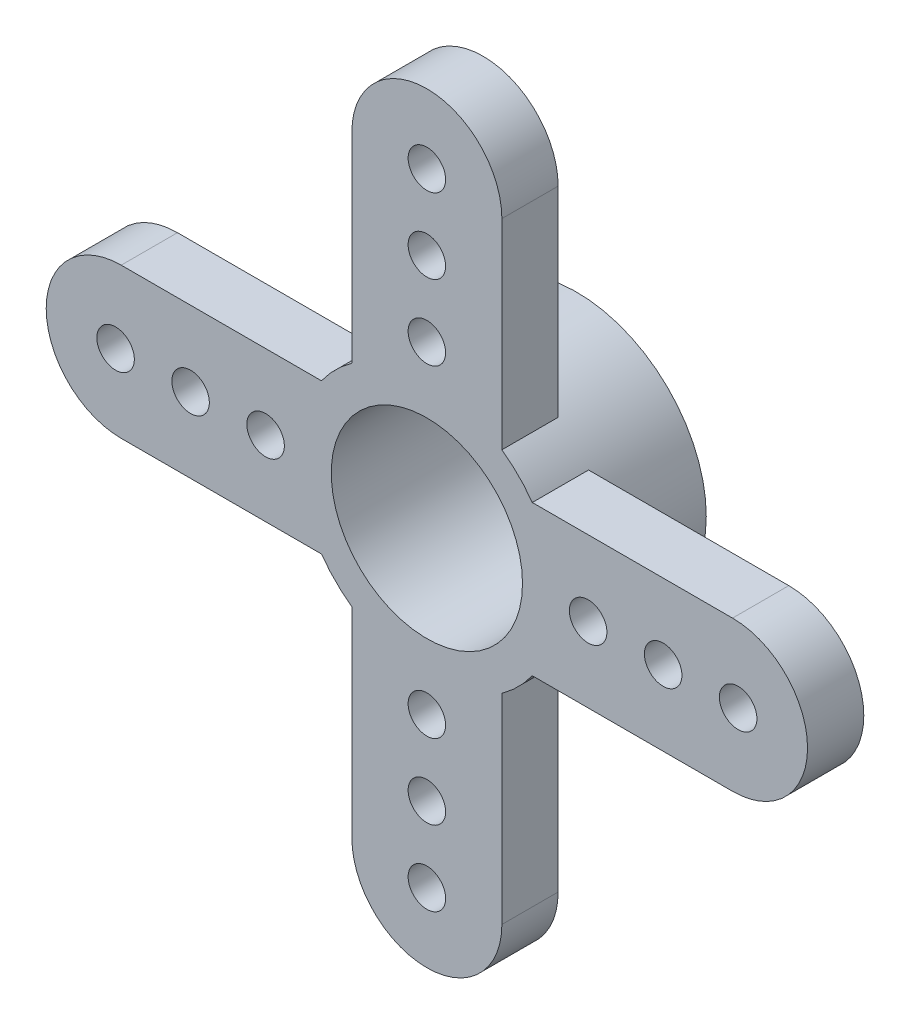
ISO-10303-21;
HEADER;
FILE_DESCRIPTION(('STEP AP214'),'2;1');
FILE_NAME('part.step','',(''),(''),'','','');
FILE_SCHEMA(('AUTOMOTIVE_DESIGN { 1 0 10303 214 1 1 1 1 }'));
ENDSEC;
DATA;
#1=APPLICATION_CONTEXT('core data for automotive mechanical design processes');
#2=APPLICATION_PROTOCOL_DEFINITION('international standard','automotive_design',2000,#1);
#3=PRODUCT_CONTEXT('',#1,'mechanical');
#4=PRODUCT('Part','Part','',(#3));
#5=PRODUCT_RELATED_PRODUCT_CATEGORY('part','',(#4));
#6=PRODUCT_DEFINITION_FORMATION('','',#4);
#7=PRODUCT_DEFINITION_CONTEXT('part definition',#1,'design');
#8=PRODUCT_DEFINITION('design','',#6,#7);
#9=PRODUCT_DEFINITION_SHAPE('','',#8);
#10=(LENGTH_UNIT() NAMED_UNIT(*) SI_UNIT(.MILLI.,.METRE.));
#11=(NAMED_UNIT(*) PLANE_ANGLE_UNIT() SI_UNIT($,.RADIAN.));
#12=(NAMED_UNIT(*) SI_UNIT($,.STERADIAN.) SOLID_ANGLE_UNIT());
#13=UNCERTAINTY_MEASURE_WITH_UNIT(LENGTH_MEASURE(1.E-05),#10,'distance_accuracy_value','');
#14=(GEOMETRIC_REPRESENTATION_CONTEXT(3) GLOBAL_UNCERTAINTY_ASSIGNED_CONTEXT((#13)) GLOBAL_UNIT_ASSIGNED_CONTEXT((#10,
#11,#12)) REPRESENTATION_CONTEXT('',''));
#15=CARTESIAN_POINT('',(0.,0.,0.));
#16=DIRECTION('',(0.,0.,1.));
#17=DIRECTION('',(1.,0.,0.));
#18=AXIS2_PLACEMENT_3D('',#15,#16,#17);
#19=CARTESIAN_POINT('',(0.,0.,0.));
#20=DIRECTION('',(0.,0.,1.));
#21=DIRECTION('',(1.,0.,0.));
#22=AXIS2_PLACEMENT_3D('',#19,#20,#21);
#23=PLANE('',#22);
#24=CARTESIAN_POINT('',(0.,4.3,0.));
#25=DIRECTION('',(0.,0.,1.));
#26=DIRECTION('',(1.,0.,0.));
#27=AXIS2_PLACEMENT_3D('',#24,#25,#26);
#28=CIRCLE('',#27,0.5);
#29=CARTESIAN_POINT('',(0.5,4.3,0.));
#30=VERTEX_POINT('',#29);
#31=EDGE_CURVE('E262',#30,#30,#28,.F.);
#32=ORIENTED_EDGE('',*,*,#31,.F.);
#33=EDGE_LOOP('',(#32));
#34=FACE_BOUND('',#33,.T.);
#35=CARTESIAN_POINT('',(0.,6.3,0.));
#36=DIRECTION('',(0.,0.,1.));
#37=DIRECTION('',(1.,0.,0.));
#38=AXIS2_PLACEMENT_3D('',#35,#36,#37);
#39=CIRCLE('',#38,0.5);
#40=CARTESIAN_POINT('',(0.5,6.3,0.));
#41=VERTEX_POINT('',#40);
#42=EDGE_CURVE('E259',#41,#41,#39,.F.);
#43=ORIENTED_EDGE('',*,*,#42,.F.);
#44=EDGE_LOOP('',(#43));
#45=FACE_BOUND('',#44,.T.);
#46=CARTESIAN_POINT('',(0.,8.3,0.));
#47=DIRECTION('',(0.,0.,1.));
#48=DIRECTION('',(1.,0.,0.));
#49=AXIS2_PLACEMENT_3D('',#46,#47,#48);
#50=CIRCLE('',#49,0.5);
#51=CARTESIAN_POINT('',(0.5,8.3,0.));
#52=VERTEX_POINT('',#51);
#53=EDGE_CURVE('E254',#52,#52,#50,.F.);
#54=ORIENTED_EDGE('',*,*,#53,.F.);
#55=EDGE_LOOP('',(#54));
#56=FACE_BOUND('',#55,.T.);
#57=DIRECTION('',(0.,1.,0.));
#58=VECTOR('',#57,1.);
#59=CARTESIAN_POINT('',(2.,-8.15,0.));
#60=LINE('',#59,#58);
#61=CARTESIAN_POINT('',(2.,2.81113855937412,0.));
#62=VERTEX_POINT('',#61);
#63=CARTESIAN_POINT('',(2.,8.15,0.));
#64=VERTEX_POINT('',#63);
#65=EDGE_CURVE('E169',#62,#64,#60,.T.);
#66=ORIENTED_EDGE('',*,*,#65,.F.);
#67=CARTESIAN_POINT('',(0.,0.,0.));
#68=DIRECTION('',(0.,0.,1.));
#69=DIRECTION('',(1.,0.,0.));
#70=AXIS2_PLACEMENT_3D('',#67,#68,#69);
#71=CIRCLE('',#70,3.45);
#72=CARTESIAN_POINT('',(-2.,2.81113855937412,0.));
#73=VERTEX_POINT('',#72);
#74=EDGE_CURVE('E11',#62,#73,#71,.T.);
#75=ORIENTED_EDGE('',*,*,#74,.T.);
#76=DIRECTION('',(0.,-1.,0.));
#77=VECTOR('',#76,1.);
#78=CARTESIAN_POINT('',(-2.,-8.15,0.));
#79=LINE('',#78,#77);
#80=CARTESIAN_POINT('',(-2.,8.15,0.));
#81=VERTEX_POINT('',#80);
#82=EDGE_CURVE('E179',#81,#73,#79,.T.);
#83=ORIENTED_EDGE('',*,*,#82,.F.);
#84=CARTESIAN_POINT('',(0.,8.15,0.));
#85=DIRECTION('',(0.,0.,1.));
#86=DIRECTION('',(1.,0.,0.));
#87=AXIS2_PLACEMENT_3D('',#84,#85,#86);
#88=CIRCLE('',#87,2.);
#89=EDGE_CURVE('E176',#64,#81,#88,.T.);
#90=ORIENTED_EDGE('',*,*,#89,.F.);
#91=EDGE_LOOP('',(#66,#75,#83,#90));
#92=FACE_BOUND('',#91,.T.);
#93=ADVANCED_FACE('F43',(#34,#45,#56,#92),#23,.F.);
#94=CARTESIAN_POINT('',(-8.3,0.,0.));
#95=DIRECTION('',(0.,0.,1.));
#96=DIRECTION('',(1.,0.,0.));
#97=AXIS2_PLACEMENT_3D('',#94,#95,#96);
#98=CIRCLE('',#97,0.5);
#99=CARTESIAN_POINT('',(-7.8,0.,0.));
#100=VERTEX_POINT('',#99);
#101=EDGE_CURVE('E287',#100,#100,#98,.F.);
#102=ORIENTED_EDGE('',*,*,#101,.F.);
#103=EDGE_LOOP('',(#102));
#104=FACE_BOUND('',#103,.T.);
#105=CARTESIAN_POINT('',(-4.3,0.,0.));
#106=DIRECTION('',(0.,0.,1.));
#107=DIRECTION('',(1.,0.,0.));
#108=AXIS2_PLACEMENT_3D('',#105,#106,#107);
#109=CIRCLE('',#108,0.5);
#110=CARTESIAN_POINT('',(-3.8,0.,0.));
#111=VERTEX_POINT('',#110);
#112=EDGE_CURVE('E274',#111,#111,#109,.F.);
#113=ORIENTED_EDGE('',*,*,#112,.F.);
#114=EDGE_LOOP('',(#113));
#115=FACE_BOUND('',#114,.T.);
#116=CARTESIAN_POINT('',(-6.3,0.,0.));
#117=DIRECTION('',(0.,0.,1.));
#118=DIRECTION('',(1.,0.,0.));
#119=AXIS2_PLACEMENT_3D('',#116,#117,#118);
#120=CIRCLE('',#119,0.5);
#121=CARTESIAN_POINT('',(-5.8,0.,0.));
#122=VERTEX_POINT('',#121);
#123=EDGE_CURVE('E275',#122,#122,#120,.F.);
#124=ORIENTED_EDGE('',*,*,#123,.F.);
#125=EDGE_LOOP('',(#124));
#126=FACE_BOUND('',#125,.T.);
#127=DIRECTION('',(-1.,0.,0.));
#128=VECTOR('',#127,1.);
#129=CARTESIAN_POINT('',(-8.15,2.,0.));
#130=LINE('',#129,#128);
#131=CARTESIAN_POINT('',(-2.81113855937412,2.,0.));
#132=VERTEX_POINT('',#131);
#133=CARTESIAN_POINT('',(-8.15,2.,0.));
#134=VERTEX_POINT('',#133);
#135=EDGE_CURVE('E215',#132,#134,#130,.T.);
#136=ORIENTED_EDGE('',*,*,#135,.F.);
#137=CARTESIAN_POINT('',(-2.81113855937412,-2.,0.));
#138=VERTEX_POINT('',#137);
#139=EDGE_CURVE('E55',#132,#138,#71,.T.);
#140=ORIENTED_EDGE('',*,*,#139,.T.);
#141=DIRECTION('',(1.,0.,0.));
#142=VECTOR('',#141,1.);
#143=CARTESIAN_POINT('',(-8.15,-2.,0.));
#144=LINE('',#143,#142);
#145=CARTESIAN_POINT('',(-8.15,-2.,0.));
#146=VERTEX_POINT('',#145);
#147=EDGE_CURVE('E207',#146,#138,#144,.T.);
#148=ORIENTED_EDGE('',*,*,#147,.F.);
#149=CARTESIAN_POINT('',(-8.15,0.,0.));
#150=DIRECTION('',(0.,0.,1.));
#151=DIRECTION('',(1.,0.,0.));
#152=AXIS2_PLACEMENT_3D('',#149,#150,#151);
#153=CIRCLE('',#152,2.);
#154=EDGE_CURVE('E301',#134,#146,#153,.T.);
#155=ORIENTED_EDGE('',*,*,#154,.F.);
#156=EDGE_LOOP('',(#136,#140,#148,#155));
#157=FACE_BOUND('',#156,.T.);
#158=ADVANCED_FACE('F365',(#104,#115,#126,#157),#23,.F.);
#159=CARTESIAN_POINT('',(0.,-8.3,0.));
#160=DIRECTION('',(0.,0.,1.));
#161=DIRECTION('',(1.,0.,0.));
#162=AXIS2_PLACEMENT_3D('',#159,#160,#161);
#163=CIRCLE('',#162,0.5);
#164=CARTESIAN_POINT('',(0.5,-8.3,0.));
#165=VERTEX_POINT('',#164);
#166=EDGE_CURVE('E283',#165,#165,#163,.F.);
#167=ORIENTED_EDGE('',*,*,#166,.F.);
#168=EDGE_LOOP('',(#167));
#169=FACE_BOUND('',#168,.T.);
#170=CARTESIAN_POINT('',(0.,-6.3,0.));
#171=DIRECTION('',(0.,0.,1.));
#172=DIRECTION('',(1.,0.,0.));
#173=AXIS2_PLACEMENT_3D('',#170,#171,#172);
#174=CIRCLE('',#173,0.5);
#175=CARTESIAN_POINT('',(0.5,-6.3,0.));
#176=VERTEX_POINT('',#175);
#177=EDGE_CURVE('E284',#176,#176,#174,.F.);
#178=ORIENTED_EDGE('',*,*,#177,.F.);
#179=EDGE_LOOP('',(#178));
#180=FACE_BOUND('',#179,.T.);
#181=CARTESIAN_POINT('',(0.,-4.3,0.));
#182=DIRECTION('',(0.,0.,1.));
#183=DIRECTION('',(1.,0.,0.));
#184=AXIS2_PLACEMENT_3D('',#181,#182,#183);
#185=CIRCLE('',#184,0.5);
#186=CARTESIAN_POINT('',(0.5,-4.3,0.));
#187=VERTEX_POINT('',#186);
#188=EDGE_CURVE('E279',#187,#187,#185,.F.);
#189=ORIENTED_EDGE('',*,*,#188,.F.);
#190=EDGE_LOOP('',(#189));
#191=FACE_BOUND('',#190,.T.);
#192=CARTESIAN_POINT('',(-2.,-2.81113855937412,0.));
#193=VERTEX_POINT('',#192);
#194=CARTESIAN_POINT('',(-2.,-8.15,0.));
#195=VERTEX_POINT('',#194);
#196=EDGE_CURVE('E185',#193,#195,#79,.T.);
#197=ORIENTED_EDGE('',*,*,#196,.F.);
#198=CARTESIAN_POINT('',(2.,-2.81113855937412,0.));
#199=VERTEX_POINT('',#198);
#200=EDGE_CURVE('E358',#193,#199,#71,.T.);
#201=ORIENTED_EDGE('',*,*,#200,.T.);
#202=CARTESIAN_POINT('',(2.,-8.15,0.));
#203=VERTEX_POINT('',#202);
#204=EDGE_CURVE('E177',#203,#199,#60,.T.);
#205=ORIENTED_EDGE('',*,*,#204,.F.);
#206=CARTESIAN_POINT('',(0.,-8.15,0.));
#207=DIRECTION('',(0.,0.,1.));
#208=DIRECTION('',(1.,0.,0.));
#209=AXIS2_PLACEMENT_3D('',#206,#207,#208);
#210=CIRCLE('',#209,2.);
#211=EDGE_CURVE('E313',#195,#203,#210,.T.);
#212=ORIENTED_EDGE('',*,*,#211,.F.);
#213=EDGE_LOOP('',(#197,#201,#205,#212));
#214=FACE_BOUND('',#213,.T.);
#215=ADVANCED_FACE('F368',(#169,#180,#191,#214),#23,.F.);
#216=CARTESIAN_POINT('',(0.,0.,1.5));
#217=DIRECTION('',(0.,0.,-1.));
#218=DIRECTION('',(-1.,0.,0.));
#219=AXIS2_PLACEMENT_3D('',#216,#217,#218);
#220=CYLINDRICAL_SURFACE('',#219,3.45);
#221=DIRECTION('',(0.,0.,-1.));
#222=VECTOR('',#221,1.);
#223=CARTESIAN_POINT('',(2.,2.81113855937412,1.5));
#224=LINE('',#223,#222);
#225=CARTESIAN_POINT('',(2.,2.81113855937412,1.5));
#226=VERTEX_POINT('',#225);
#227=EDGE_CURVE('E160',#226,#62,#224,.T.);
#228=ORIENTED_EDGE('',*,*,#227,.F.);
#229=CARTESIAN_POINT('',(0.,0.,1.5));
#230=DIRECTION('',(0.,0.,1.));
#231=DIRECTION('',(1.,0.,0.));
#232=AXIS2_PLACEMENT_3D('',#229,#230,#231);
#233=CIRCLE('',#232,3.45);
#234=CARTESIAN_POINT('',(2.81113855937412,2.,1.5));
#235=VERTEX_POINT('',#234);
#236=EDGE_CURVE('E239',#235,#226,#233,.T.);
#237=ORIENTED_EDGE('',*,*,#236,.F.);
#238=DIRECTION('',(0.,0.,-1.));
#239=VECTOR('',#238,1.);
#240=CARTESIAN_POINT('',(2.81113855937412,2.,1.5));
#241=LINE('',#240,#239);
#242=CARTESIAN_POINT('',(2.81113855937412,2.,0.));
#243=VERTEX_POINT('',#242);
#244=EDGE_CURVE('E229',#243,#235,#241,.F.);
#245=ORIENTED_EDGE('',*,*,#244,.F.);
#246=CARTESIAN_POINT('',(2.81113855937412,-2.,0.));
#247=VERTEX_POINT('',#246);
#248=EDGE_CURVE('E53',#247,#243,#71,.T.);
#249=ORIENTED_EDGE('',*,*,#248,.F.);
#250=DIRECTION('',(0.,0.,-1.));
#251=VECTOR('',#250,1.);
#252=CARTESIAN_POINT('',(2.81113855937412,-2.,1.5));
#253=LINE('',#252,#251);
#254=CARTESIAN_POINT('',(2.81113855937412,-2.,1.5));
#255=VERTEX_POINT('',#254);
#256=EDGE_CURVE('E235',#255,#247,#253,.T.);
#257=ORIENTED_EDGE('',*,*,#256,.F.);
#258=CARTESIAN_POINT('',(2.,-2.81113855937412,1.5));
#259=VERTEX_POINT('',#258);
#260=EDGE_CURVE('E236',#259,#255,#233,.T.);
#261=ORIENTED_EDGE('',*,*,#260,.F.);
#262=DIRECTION('',(0.,0.,-1.));
#263=VECTOR('',#262,1.);
#264=CARTESIAN_POINT('',(2.,-2.81113855937412,1.5));
#265=LINE('',#264,#263);
#266=EDGE_CURVE('E174',#199,#259,#265,.F.);
#267=ORIENTED_EDGE('',*,*,#266,.F.);
#268=ORIENTED_EDGE('',*,*,#200,.F.);
#269=DIRECTION('',(0.,0.,-1.));
#270=VECTOR('',#269,1.);
#271=CARTESIAN_POINT('',(-2.,-2.81113855937412,1.5));
#272=LINE('',#271,#270);
#273=CARTESIAN_POINT('',(-2.,-2.81113855937412,1.5));
#274=VERTEX_POINT('',#273);
#275=EDGE_CURVE('E64',#274,#193,#272,.T.);
#276=ORIENTED_EDGE('',*,*,#275,.F.);
#277=CARTESIAN_POINT('',(-2.81113855937412,-2.,1.5));
#278=VERTEX_POINT('',#277);
#279=EDGE_CURVE('E244',#278,#274,#233,.T.);
#280=ORIENTED_EDGE('',*,*,#279,.F.);
#281=DIRECTION('',(0.,0.,-1.));
#282=VECTOR('',#281,1.);
#283=CARTESIAN_POINT('',(-2.81113855937412,-2.,1.5));
#284=LINE('',#283,#282);
#285=EDGE_CURVE('E232',#138,#278,#284,.F.);
#286=ORIENTED_EDGE('',*,*,#285,.F.);
#287=ORIENTED_EDGE('',*,*,#139,.F.);
#288=DIRECTION('',(0.,0.,-1.));
#289=VECTOR('',#288,1.);
#290=CARTESIAN_POINT('',(-2.81113855937412,2.,1.5));
#291=LINE('',#290,#289);
#292=CARTESIAN_POINT('',(-2.81113855937412,2.,1.5));
#293=VERTEX_POINT('',#292);
#294=EDGE_CURVE('E228',#293,#132,#291,.T.);
#295=ORIENTED_EDGE('',*,*,#294,.F.);
#296=CARTESIAN_POINT('',(-2.,2.81113855937412,1.5));
#297=VERTEX_POINT('',#296);
#298=EDGE_CURVE('E69',#297,#293,#233,.T.);
#299=ORIENTED_EDGE('',*,*,#298,.F.);
#300=DIRECTION('',(0.,0.,-1.));
#301=VECTOR('',#300,1.);
#302=CARTESIAN_POINT('',(-2.,2.81113855937412,1.5));
#303=LINE('',#302,#301);
#304=EDGE_CURVE('E157',#73,#297,#303,.F.);
#305=ORIENTED_EDGE('',*,*,#304,.F.);
#306=ORIENTED_EDGE('',*,*,#74,.F.);
#307=EDGE_LOOP('',(#228,#237,#245,#249,#257,#261,#267,#268,#276,#280,#286,#287,#295,#299,#305,#306));
#308=FACE_BOUND('',#307,.T.);
#309=CARTESIAN_POINT('',(0.,0.,-2.5));
#310=DIRECTION('',(0.,0.,1.));
#311=DIRECTION('',(1.,0.,0.));
#312=AXIS2_PLACEMENT_3D('',#309,#310,#311);
#313=CIRCLE('',#312,3.45);
#314=CARTESIAN_POINT('',(3.45,0.,-2.5));
#315=VERTEX_POINT('',#314);
#316=EDGE_CURVE('E242',#315,#315,#313,.T.);
#317=ORIENTED_EDGE('',*,*,#316,.T.);
#318=EDGE_LOOP('',(#317));
#319=FACE_BOUND('',#318,.T.);
#320=ADVANCED_FACE('F44',(#308,#319),#220,.T.);
#321=CARTESIAN_POINT('',(0.,0.,1.5));
#322=DIRECTION('',(0.,0.,1.));
#323=DIRECTION('',(1.,0.,0.));
#324=AXIS2_PLACEMENT_3D('',#321,#322,#323);
#325=PLANE('',#324);
#326=CARTESIAN_POINT('',(-8.3,0.,1.5));
#327=DIRECTION('',(0.,0.,1.));
#328=DIRECTION('',(1.,0.,0.));
#329=AXIS2_PLACEMENT_3D('',#326,#327,#328);
#330=CIRCLE('',#329,0.5);
#331=CARTESIAN_POINT('',(-7.8,0.,1.5));
#332=VERTEX_POINT('',#331);
#333=EDGE_CURVE('E250',#332,#332,#330,.T.);
#334=ORIENTED_EDGE('',*,*,#333,.F.);
#335=EDGE_LOOP('',(#334));
#336=FACE_BOUND('',#335,.T.);
#337=CARTESIAN_POINT('',(8.3,0.,1.5));
#338=DIRECTION('',(0.,0.,1.));
#339=DIRECTION('',(1.,0.,0.));
#340=AXIS2_PLACEMENT_3D('',#337,#338,#339);
#341=CIRCLE('',#340,0.5);
#342=CARTESIAN_POINT('',(8.8,0.,1.5));
#343=VERTEX_POINT('',#342);
#344=EDGE_CURVE('E476',#343,#343,#341,.T.);
#345=ORIENTED_EDGE('',*,*,#344,.F.);
#346=EDGE_LOOP('',(#345));
#347=FACE_BOUND('',#346,.T.);
#348=CARTESIAN_POINT('',(0.,-8.3,1.5));
#349=DIRECTION('',(0.,0.,1.));
#350=DIRECTION('',(1.,0.,0.));
#351=AXIS2_PLACEMENT_3D('',#348,#349,#350);
#352=CIRCLE('',#351,0.5);
#353=CARTESIAN_POINT('',(0.5,-8.3,1.5));
#354=VERTEX_POINT('',#353);
#355=EDGE_CURVE('E471',#354,#354,#352,.T.);
#356=ORIENTED_EDGE('',*,*,#355,.F.);
#357=EDGE_LOOP('',(#356));
#358=FACE_BOUND('',#357,.T.);
#359=CARTESIAN_POINT('',(0.,-6.3,1.5));
#360=DIRECTION('',(0.,0.,1.));
#361=DIRECTION('',(1.,0.,0.));
#362=AXIS2_PLACEMENT_3D('',#359,#360,#361);
#363=CIRCLE('',#362,0.5);
#364=CARTESIAN_POINT('',(0.5,-6.3,1.5));
#365=VERTEX_POINT('',#364);
#366=EDGE_CURVE('E470',#365,#365,#363,.T.);
#367=ORIENTED_EDGE('',*,*,#366,.F.);
#368=EDGE_LOOP('',(#367));
#369=FACE_BOUND('',#368,.T.);
#370=CARTESIAN_POINT('',(0.,-4.3,1.5));
#371=DIRECTION('',(0.,0.,1.));
#372=DIRECTION('',(1.,0.,0.));
#373=AXIS2_PLACEMENT_3D('',#370,#371,#372);
#374=CIRCLE('',#373,0.5);
#375=CARTESIAN_POINT('',(0.5,-4.3,1.5));
#376=VERTEX_POINT('',#375);
#377=EDGE_CURVE('E475',#376,#376,#374,.T.);
#378=ORIENTED_EDGE('',*,*,#377,.F.);
#379=EDGE_LOOP('',(#378));
#380=FACE_BOUND('',#379,.T.);
#381=CARTESIAN_POINT('',(6.3,0.,1.5));
#382=DIRECTION('',(0.,0.,1.));
#383=DIRECTION('',(1.,0.,0.));
#384=AXIS2_PLACEMENT_3D('',#381,#382,#383);
#385=CIRCLE('',#384,0.5);
#386=CARTESIAN_POINT('',(6.8,0.,1.5));
#387=VERTEX_POINT('',#386);
#388=EDGE_CURVE('E481',#387,#387,#385,.T.);
#389=ORIENTED_EDGE('',*,*,#388,.F.);
#390=EDGE_LOOP('',(#389));
#391=FACE_BOUND('',#390,.T.);
#392=CARTESIAN_POINT('',(4.3,0.,1.5));
#393=DIRECTION('',(0.,0.,1.));
#394=DIRECTION('',(1.,0.,0.));
#395=AXIS2_PLACEMENT_3D('',#392,#393,#394);
#396=CIRCLE('',#395,0.5);
#397=CARTESIAN_POINT('',(4.8,0.,1.5));
#398=VERTEX_POINT('',#397);
#399=EDGE_CURVE('E486',#398,#398,#396,.T.);
#400=ORIENTED_EDGE('',*,*,#399,.F.);
#401=EDGE_LOOP('',(#400));
#402=FACE_BOUND('',#401,.T.);
#403=CARTESIAN_POINT('',(-4.3,0.,1.5));
#404=DIRECTION('',(0.,0.,1.));
#405=DIRECTION('',(1.,0.,0.));
#406=AXIS2_PLACEMENT_3D('',#403,#404,#405);
#407=CIRCLE('',#406,0.5);
#408=CARTESIAN_POINT('',(-3.8,0.,1.5));
#409=VERTEX_POINT('',#408);
#410=EDGE_CURVE('E467',#409,#409,#407,.T.);
#411=ORIENTED_EDGE('',*,*,#410,.F.);
#412=EDGE_LOOP('',(#411));
#413=FACE_BOUND('',#412,.T.);
#414=CARTESIAN_POINT('',(-6.3,0.,1.5));
#415=DIRECTION('',(0.,0.,1.));
#416=DIRECTION('',(1.,0.,0.));
#417=AXIS2_PLACEMENT_3D('',#414,#415,#416);
#418=CIRCLE('',#417,0.5);
#419=CARTESIAN_POINT('',(-5.8,0.,1.5));
#420=VERTEX_POINT('',#419);
#421=EDGE_CURVE('E463',#420,#420,#418,.T.);
#422=ORIENTED_EDGE('',*,*,#421,.F.);
#423=EDGE_LOOP('',(#422));
#424=FACE_BOUND('',#423,.T.);
#425=CARTESIAN_POINT('',(0.,4.3,1.5));
#426=DIRECTION('',(0.,0.,1.));
#427=DIRECTION('',(1.,0.,0.));
#428=AXIS2_PLACEMENT_3D('',#425,#426,#427);
#429=CIRCLE('',#428,0.5);
#430=CARTESIAN_POINT('',(0.5,4.3,1.5));
#431=VERTEX_POINT('',#430);
#432=EDGE_CURVE('E480',#431,#431,#429,.T.);
#433=ORIENTED_EDGE('',*,*,#432,.F.);
#434=EDGE_LOOP('',(#433));
#435=FACE_BOUND('',#434,.T.);
#436=CARTESIAN_POINT('',(0.,6.3,1.5));
#437=DIRECTION('',(0.,0.,1.));
#438=DIRECTION('',(1.,0.,0.));
#439=AXIS2_PLACEMENT_3D('',#436,#437,#438);
#440=CIRCLE('',#439,0.5);
#441=CARTESIAN_POINT('',(0.5,6.3,1.5));
#442=VERTEX_POINT('',#441);
#443=EDGE_CURVE('E495',#442,#442,#440,.T.);
#444=ORIENTED_EDGE('',*,*,#443,.F.);
#445=EDGE_LOOP('',(#444));
#446=FACE_BOUND('',#445,.T.);
#447=CARTESIAN_POINT('',(0.,8.3,1.5));
#448=DIRECTION('',(0.,0.,1.));
#449=DIRECTION('',(1.,0.,0.));
#450=AXIS2_PLACEMENT_3D('',#447,#448,#449);
#451=CIRCLE('',#450,0.5);
#452=CARTESIAN_POINT('',(0.5,8.3,1.5));
#453=VERTEX_POINT('',#452);
#454=EDGE_CURVE('E270',#453,#453,#451,.T.);
#455=ORIENTED_EDGE('',*,*,#454,.F.);
#456=EDGE_LOOP('',(#455));
#457=FACE_BOUND('',#456,.T.);
#458=CARTESIAN_POINT('',(0.,0.,1.5));
#459=DIRECTION('',(0.,0.,1.));
#460=DIRECTION('',(1.,0.,0.));
#461=AXIS2_PLACEMENT_3D('',#458,#459,#460);
#462=CIRCLE('',#461,2.55);
#463=CARTESIAN_POINT('',(2.55,0.,1.5));
#464=VERTEX_POINT('',#463);
#465=EDGE_CURVE('E246',#464,#464,#462,.T.);
#466=ORIENTED_EDGE('',*,*,#465,.F.);
#467=EDGE_LOOP('',(#466));
#468=FACE_BOUND('',#467,.T.);
#469=DIRECTION('',(0.,-1.,0.));
#470=VECTOR('',#469,1.);
#471=CARTESIAN_POINT('',(-2.,-8.15,1.5));
#472=LINE('',#471,#470);
#473=CARTESIAN_POINT('',(-2.,-8.15,1.5));
#474=VERTEX_POINT('',#473);
#475=EDGE_CURVE('E182',#274,#474,#472,.T.);
#476=ORIENTED_EDGE('',*,*,#475,.T.);
#477=CARTESIAN_POINT('',(0.,-8.15,1.5));
#478=DIRECTION('',(0.,0.,1.));
#479=DIRECTION('',(1.,0.,0.));
#480=AXIS2_PLACEMENT_3D('',#477,#478,#479);
#481=CIRCLE('',#480,2.);
#482=CARTESIAN_POINT('',(2.,-8.15,1.5));
#483=VERTEX_POINT('',#482);
#484=EDGE_CURVE('E294',#474,#483,#481,.T.);
#485=ORIENTED_EDGE('',*,*,#484,.T.);
#486=DIRECTION('',(0.,1.,0.));
#487=VECTOR('',#486,1.);
#488=CARTESIAN_POINT('',(2.,-8.15,1.5));
#489=LINE('',#488,#487);
#490=EDGE_CURVE('E188',#483,#259,#489,.T.);
#491=ORIENTED_EDGE('',*,*,#490,.T.);
#492=ORIENTED_EDGE('',*,*,#260,.T.);
#493=DIRECTION('',(1.,0.,0.));
#494=VECTOR('',#493,1.);
#495=CARTESIAN_POINT('',(-8.15,-2.,1.5));
#496=LINE('',#495,#494);
#497=CARTESIAN_POINT('',(8.15,-2.,1.5));
#498=VERTEX_POINT('',#497);
#499=EDGE_CURVE('E204',#255,#498,#496,.T.);
#500=ORIENTED_EDGE('',*,*,#499,.T.);
#501=CARTESIAN_POINT('',(8.15,0.,1.5));
#502=DIRECTION('',(0.,0.,1.));
#503=DIRECTION('',(1.,0.,0.));
#504=AXIS2_PLACEMENT_3D('',#501,#502,#503);
#505=CIRCLE('',#504,2.);
#506=CARTESIAN_POINT('',(8.15,2.,1.5));
#507=VERTEX_POINT('',#506);
#508=EDGE_CURVE('E293',#498,#507,#505,.T.);
#509=ORIENTED_EDGE('',*,*,#508,.T.);
#510=DIRECTION('',(-1.,0.,0.));
#511=VECTOR('',#510,1.);
#512=CARTESIAN_POINT('',(-8.15,2.,1.5));
#513=LINE('',#512,#511);
#514=EDGE_CURVE('E202',#507,#235,#513,.T.);
#515=ORIENTED_EDGE('',*,*,#514,.T.);
#516=ORIENTED_EDGE('',*,*,#236,.T.);
#517=CARTESIAN_POINT('',(2.,8.15,1.5));
#518=VERTEX_POINT('',#517);
#519=EDGE_CURVE('E168',#226,#518,#489,.T.);
#520=ORIENTED_EDGE('',*,*,#519,.T.);
#521=CARTESIAN_POINT('',(0.,8.15,1.5));
#522=DIRECTION('',(0.,0.,1.));
#523=DIRECTION('',(1.,0.,0.));
#524=AXIS2_PLACEMENT_3D('',#521,#522,#523);
#525=CIRCLE('',#524,2.);
#526=CARTESIAN_POINT('',(-2.,8.15,1.5));
#527=VERTEX_POINT('',#526);
#528=EDGE_CURVE('E306',#518,#527,#525,.T.);
#529=ORIENTED_EDGE('',*,*,#528,.T.);
#530=EDGE_CURVE('E316',#527,#297,#472,.T.);
#531=ORIENTED_EDGE('',*,*,#530,.T.);
#532=ORIENTED_EDGE('',*,*,#298,.T.);
#533=CARTESIAN_POINT('',(-8.15,2.,1.5));
#534=VERTEX_POINT('',#533);
#535=EDGE_CURVE('E201',#293,#534,#513,.T.);
#536=ORIENTED_EDGE('',*,*,#535,.T.);
#537=CARTESIAN_POINT('',(-8.15,0.,1.5));
#538=DIRECTION('',(0.,0.,1.));
#539=DIRECTION('',(1.,0.,0.));
#540=AXIS2_PLACEMENT_3D('',#537,#538,#539);
#541=CIRCLE('',#540,2.);
#542=CARTESIAN_POINT('',(-8.15,-2.,1.5));
#543=VERTEX_POINT('',#542);
#544=EDGE_CURVE('E303',#534,#543,#541,.T.);
#545=ORIENTED_EDGE('',*,*,#544,.T.);
#546=EDGE_CURVE('E199',#543,#278,#496,.T.);
#547=ORIENTED_EDGE('',*,*,#546,.T.);
#548=ORIENTED_EDGE('',*,*,#279,.T.);
#549=EDGE_LOOP('',(#476,#485,#491,#492,#500,#509,#515,#516,#520,#529,#531,#532,#536,#545,#547,#548));
#550=FACE_BOUND('',#549,.T.);
#551=ADVANCED_FACE('F319',(#336,#347,#358,#369,#380,#391,#402,#413,#424,#435,#446,#457,#468,
#550),#325,.T.);
#552=CARTESIAN_POINT('',(8.3,0.,0.));
#553=DIRECTION('',(0.,0.,1.));
#554=DIRECTION('',(1.,0.,0.));
#555=AXIS2_PLACEMENT_3D('',#552,#553,#554);
#556=CIRCLE('',#555,0.5);
#557=CARTESIAN_POINT('',(8.8,0.,0.));
#558=VERTEX_POINT('',#557);
#559=EDGE_CURVE('E50',#558,#558,#556,.F.);
#560=ORIENTED_EDGE('',*,*,#559,.F.);
#561=EDGE_LOOP('',(#560));
#562=FACE_BOUND('',#561,.T.);
#563=CARTESIAN_POINT('',(6.3,0.,0.));
#564=DIRECTION('',(0.,0.,1.));
#565=DIRECTION('',(1.,0.,0.));
#566=AXIS2_PLACEMENT_3D('',#563,#564,#565);
#567=CIRCLE('',#566,0.5);
#568=CARTESIAN_POINT('',(6.8,0.,0.));
#569=VERTEX_POINT('',#568);
#570=EDGE_CURVE('E248',#569,#569,#567,.F.);
#571=ORIENTED_EDGE('',*,*,#570,.F.);
#572=EDGE_LOOP('',(#571));
#573=FACE_BOUND('',#572,.T.);
#574=CARTESIAN_POINT('',(4.3,0.,0.));
#575=DIRECTION('',(0.,0.,1.));
#576=DIRECTION('',(1.,0.,0.));
#577=AXIS2_PLACEMENT_3D('',#574,#575,#576);
#578=CIRCLE('',#577,0.5);
#579=CARTESIAN_POINT('',(4.8,0.,0.));
#580=VERTEX_POINT('',#579);
#581=EDGE_CURVE('E247',#580,#580,#578,.F.);
#582=ORIENTED_EDGE('',*,*,#581,.F.);
#583=EDGE_LOOP('',(#582));
#584=FACE_BOUND('',#583,.T.);
#585=CARTESIAN_POINT('',(8.15,-2.,0.));
#586=VERTEX_POINT('',#585);
#587=EDGE_CURVE('E200',#247,#586,#144,.T.);
#588=ORIENTED_EDGE('',*,*,#587,.F.);
#589=ORIENTED_EDGE('',*,*,#248,.T.);
#590=CARTESIAN_POINT('',(8.15,2.,0.));
#591=VERTEX_POINT('',#590);
#592=EDGE_CURVE('E213',#591,#243,#130,.T.);
#593=ORIENTED_EDGE('',*,*,#592,.F.);
#594=CARTESIAN_POINT('',(8.15,0.,0.));
#595=DIRECTION('',(0.,0.,1.));
#596=DIRECTION('',(1.,0.,0.));
#597=AXIS2_PLACEMENT_3D('',#594,#595,#596);
#598=CIRCLE('',#597,2.);
#599=EDGE_CURVE('E300',#586,#591,#598,.T.);
#600=ORIENTED_EDGE('',*,*,#599,.F.);
#601=EDGE_LOOP('',(#588,#589,#593,#600));
#602=FACE_BOUND('',#601,.T.);
#603=ADVANCED_FACE('F359',(#562,#573,#584,#602),#23,.F.);
#604=CARTESIAN_POINT('',(-8.15,2.,1.5));
#605=DIRECTION('',(0.,-1.,0.));
#606=DIRECTION('',(0.,0.,-1.));
#607=AXIS2_PLACEMENT_3D('',#604,#605,#606);
#608=PLANE('',#607);
#609=ORIENTED_EDGE('',*,*,#592,.T.);
#610=ORIENTED_EDGE('',*,*,#244,.T.);
#611=ORIENTED_EDGE('',*,*,#514,.F.);
#612=DIRECTION('',(0.,0.,-1.));
#613=VECTOR('',#612,1.);
#614=CARTESIAN_POINT('',(8.15,2.,1.5));
#615=LINE('',#614,#613);
#616=EDGE_CURVE('E217',#507,#591,#615,.T.);
#617=ORIENTED_EDGE('',*,*,#616,.T.);
#618=EDGE_LOOP('',(#609,#610,#611,#617));
#619=FACE_BOUND('',#618,.T.);
#620=ADVANCED_FACE('F352',(#619),#608,.F.);
#621=CARTESIAN_POINT('',(-8.15,-2.,1.5));
#622=DIRECTION('',(0.,1.,0.));
#623=DIRECTION('',(0.,0.,1.));
#624=AXIS2_PLACEMENT_3D('',#621,#622,#623);
#625=PLANE('',#624);
#626=ORIENTED_EDGE('',*,*,#499,.F.);
#627=ORIENTED_EDGE('',*,*,#256,.T.);
#628=ORIENTED_EDGE('',*,*,#587,.T.);
#629=DIRECTION('',(0.,0.,-1.));
#630=VECTOR('',#629,1.);
#631=CARTESIAN_POINT('',(8.15,-2.,1.5));
#632=LINE('',#631,#630);
#633=EDGE_CURVE('E219',#498,#586,#632,.T.);
#634=ORIENTED_EDGE('',*,*,#633,.F.);
#635=EDGE_LOOP('',(#626,#627,#628,#634));
#636=FACE_BOUND('',#635,.T.);
#637=ADVANCED_FACE('F346',(#636),#625,.F.);
#638=ORIENTED_EDGE('',*,*,#147,.T.);
#639=ORIENTED_EDGE('',*,*,#285,.T.);
#640=ORIENTED_EDGE('',*,*,#546,.F.);
#641=DIRECTION('',(0.,0.,-1.));
#642=VECTOR('',#641,1.);
#643=CARTESIAN_POINT('',(-8.15,-2.,1.5));
#644=LINE('',#643,#642);
#645=EDGE_CURVE('E224',#543,#146,#644,.T.);
#646=ORIENTED_EDGE('',*,*,#645,.T.);
#647=EDGE_LOOP('',(#638,#639,#640,#646));
#648=FACE_BOUND('',#647,.T.);
#649=ADVANCED_FACE('F337',(#648),#625,.F.);
#650=ORIENTED_EDGE('',*,*,#535,.F.);
#651=ORIENTED_EDGE('',*,*,#294,.T.);
#652=ORIENTED_EDGE('',*,*,#135,.T.);
#653=DIRECTION('',(0.,0.,-1.));
#654=VECTOR('',#653,1.);
#655=CARTESIAN_POINT('',(-8.15,2.,1.5));
#656=LINE('',#655,#654);
#657=EDGE_CURVE('E208',#534,#134,#656,.T.);
#658=ORIENTED_EDGE('',*,*,#657,.F.);
#659=EDGE_LOOP('',(#650,#651,#652,#658));
#660=FACE_BOUND('',#659,.T.);
#661=ADVANCED_FACE('F335',(#660),#608,.F.);
#662=CARTESIAN_POINT('',(-2.,-8.15,1.5));
#663=DIRECTION('',(1.,0.,0.));
#664=DIRECTION('',(0.,0.,-1.));
#665=AXIS2_PLACEMENT_3D('',#662,#663,#664);
#666=PLANE('',#665);
#667=ORIENTED_EDGE('',*,*,#82,.T.);
#668=ORIENTED_EDGE('',*,*,#304,.T.);
#669=ORIENTED_EDGE('',*,*,#530,.F.);
#670=DIRECTION('',(0.,0.,-1.));
#671=VECTOR('',#670,1.);
#672=CARTESIAN_POINT('',(-2.,8.15,1.5));
#673=LINE('',#672,#671);
#674=EDGE_CURVE('E189',#527,#81,#673,.T.);
#675=ORIENTED_EDGE('',*,*,#674,.T.);
#676=EDGE_LOOP('',(#667,#668,#669,#675));
#677=FACE_BOUND('',#676,.T.);
#678=ADVANCED_FACE('F326',(#677),#666,.F.);
#679=CARTESIAN_POINT('',(2.,-8.15,1.5));
#680=DIRECTION('',(-1.,0.,0.));
#681=DIRECTION('',(0.,0.,1.));
#682=AXIS2_PLACEMENT_3D('',#679,#680,#681);
#683=PLANE('',#682);
#684=ORIENTED_EDGE('',*,*,#519,.F.);
#685=ORIENTED_EDGE('',*,*,#227,.T.);
#686=ORIENTED_EDGE('',*,*,#65,.T.);
#687=DIRECTION('',(0.,0.,-1.));
#688=VECTOR('',#687,1.);
#689=CARTESIAN_POINT('',(2.,8.15,1.5));
#690=LINE('',#689,#688);
#691=EDGE_CURVE('E190',#518,#64,#690,.T.);
#692=ORIENTED_EDGE('',*,*,#691,.F.);
#693=EDGE_LOOP('',(#684,#685,#686,#692));
#694=FACE_BOUND('',#693,.T.);
#695=ADVANCED_FACE('F167',(#694),#683,.F.);
#696=ORIENTED_EDGE('',*,*,#475,.F.);
#697=ORIENTED_EDGE('',*,*,#275,.T.);
#698=ORIENTED_EDGE('',*,*,#196,.T.);
#699=DIRECTION('',(0.,0.,-1.));
#700=VECTOR('',#699,1.);
#701=CARTESIAN_POINT('',(-2.,-8.15,1.5));
#702=LINE('',#701,#700);
#703=EDGE_CURVE('E171',#474,#195,#702,.T.);
#704=ORIENTED_EDGE('',*,*,#703,.F.);
#705=EDGE_LOOP('',(#696,#697,#698,#704));
#706=FACE_BOUND('',#705,.T.);
#707=ADVANCED_FACE('F387',(#706),#666,.F.);
#708=ORIENTED_EDGE('',*,*,#204,.T.);
#709=ORIENTED_EDGE('',*,*,#266,.T.);
#710=ORIENTED_EDGE('',*,*,#490,.F.);
#711=DIRECTION('',(0.,0.,-1.));
#712=VECTOR('',#711,1.);
#713=CARTESIAN_POINT('',(2.,-8.15,1.5));
#714=LINE('',#713,#712);
#715=EDGE_CURVE('E191',#483,#203,#714,.T.);
#716=ORIENTED_EDGE('',*,*,#715,.T.);
#717=EDGE_LOOP('',(#708,#709,#710,#716));
#718=FACE_BOUND('',#717,.T.);
#719=ADVANCED_FACE('F386',(#718),#683,.F.);
#720=CARTESIAN_POINT('',(0.,-8.15,1.5));
#721=DIRECTION('',(0.,0.,-1.));
#722=DIRECTION('',(-1.,0.,0.));
#723=AXIS2_PLACEMENT_3D('',#720,#721,#722);
#724=CYLINDRICAL_SURFACE('',#723,2.);
#725=ORIENTED_EDGE('',*,*,#211,.T.);
#726=ORIENTED_EDGE('',*,*,#715,.F.);
#727=ORIENTED_EDGE('',*,*,#484,.F.);
#728=ORIENTED_EDGE('',*,*,#703,.T.);
#729=EDGE_LOOP('',(#725,#726,#727,#728));
#730=FACE_BOUND('',#729,.T.);
#731=ADVANCED_FACE('F395',(#730),#724,.T.);
#732=CARTESIAN_POINT('',(0.,8.15,1.5));
#733=DIRECTION('',(0.,0.,-1.));
#734=DIRECTION('',(-1.,0.,0.));
#735=AXIS2_PLACEMENT_3D('',#732,#733,#734);
#736=CYLINDRICAL_SURFACE('',#735,2.);
#737=ORIENTED_EDGE('',*,*,#89,.T.);
#738=ORIENTED_EDGE('',*,*,#674,.F.);
#739=ORIENTED_EDGE('',*,*,#528,.F.);
#740=ORIENTED_EDGE('',*,*,#691,.T.);
#741=EDGE_LOOP('',(#737,#738,#739,#740));
#742=FACE_BOUND('',#741,.T.);
#743=ADVANCED_FACE('F322',(#742),#736,.T.);
#744=CARTESIAN_POINT('',(-8.15,0.,1.5));
#745=DIRECTION('',(0.,0.,-1.));
#746=DIRECTION('',(-1.,0.,0.));
#747=AXIS2_PLACEMENT_3D('',#744,#745,#746);
#748=CYLINDRICAL_SURFACE('',#747,2.);
#749=ORIENTED_EDGE('',*,*,#154,.T.);
#750=ORIENTED_EDGE('',*,*,#645,.F.);
#751=ORIENTED_EDGE('',*,*,#544,.F.);
#752=ORIENTED_EDGE('',*,*,#657,.T.);
#753=EDGE_LOOP('',(#749,#750,#751,#752));
#754=FACE_BOUND('',#753,.T.);
#755=ADVANCED_FACE('F336',(#754),#748,.T.);
#756=CARTESIAN_POINT('',(8.15,0.,1.5));
#757=DIRECTION('',(0.,0.,-1.));
#758=DIRECTION('',(-1.,0.,0.));
#759=AXIS2_PLACEMENT_3D('',#756,#757,#758);
#760=CYLINDRICAL_SURFACE('',#759,2.);
#761=ORIENTED_EDGE('',*,*,#599,.T.);
#762=ORIENTED_EDGE('',*,*,#616,.F.);
#763=ORIENTED_EDGE('',*,*,#508,.F.);
#764=ORIENTED_EDGE('',*,*,#633,.T.);
#765=EDGE_LOOP('',(#761,#762,#763,#764));
#766=FACE_BOUND('',#765,.T.);
#767=ADVANCED_FACE('F355',(#766),#760,.T.);
#768=CARTESIAN_POINT('',(0.,0.,-2.5));
#769=DIRECTION('',(0.,0.,1.));
#770=DIRECTION('',(1.,0.,0.));
#771=AXIS2_PLACEMENT_3D('',#768,#769,#770);
#772=PLANE('',#771);
#773=CARTESIAN_POINT('',(0.,0.,-2.5));
#774=DIRECTION('',(0.,0.,1.));
#775=DIRECTION('',(1.,0.,0.));
#776=AXIS2_PLACEMENT_3D('',#773,#774,#775);
#777=CIRCLE('',#776,2.55);
#778=CARTESIAN_POINT('',(2.55,0.,-2.5));
#779=VERTEX_POINT('',#778);
#780=EDGE_CURVE('E241',#779,#779,#777,.F.);
#781=ORIENTED_EDGE('',*,*,#780,.F.);
#782=EDGE_LOOP('',(#781));
#783=FACE_BOUND('',#782,.T.);
#784=ORIENTED_EDGE('',*,*,#316,.F.);
#785=EDGE_LOOP('',(#784));
#786=FACE_BOUND('',#785,.T.);
#787=ADVANCED_FACE('F404',(#783,#786),#772,.F.);
#788=CARTESIAN_POINT('',(0.,0.,1.5));
#789=DIRECTION('',(0.,0.,-1.));
#790=DIRECTION('',(-1.,0.,0.));
#791=AXIS2_PLACEMENT_3D('',#788,#789,#790);
#792=CYLINDRICAL_SURFACE('',#791,2.55);
#793=ORIENTED_EDGE('',*,*,#465,.T.);
#794=EDGE_LOOP('',(#793));
#795=FACE_BOUND('',#794,.T.);
#796=ORIENTED_EDGE('',*,*,#780,.T.);
#797=EDGE_LOOP('',(#796));
#798=FACE_BOUND('',#797,.T.);
#799=ADVANCED_FACE('F406',(#795,#798),#792,.F.);
#800=CARTESIAN_POINT('',(4.3,0.,1.5));
#801=DIRECTION('',(0.,0.,-1.));
#802=DIRECTION('',(-1.,0.,0.));
#803=AXIS2_PLACEMENT_3D('',#800,#801,#802);
#804=CYLINDRICAL_SURFACE('',#803,0.5);
#805=ORIENTED_EDGE('',*,*,#399,.T.);
#806=EDGE_LOOP('',(#805));
#807=FACE_BOUND('',#806,.T.);
#808=ORIENTED_EDGE('',*,*,#581,.T.);
#809=EDGE_LOOP('',(#808));
#810=FACE_BOUND('',#809,.T.);
#811=ADVANCED_FACE('F411',(#807,#810),#804,.F.);
#812=CARTESIAN_POINT('',(6.3,0.,1.5));
#813=DIRECTION('',(0.,0.,-1.));
#814=DIRECTION('',(-1.,0.,0.));
#815=AXIS2_PLACEMENT_3D('',#812,#813,#814);
#816=CYLINDRICAL_SURFACE('',#815,0.5);
#817=ORIENTED_EDGE('',*,*,#388,.T.);
#818=EDGE_LOOP('',(#817));
#819=FACE_BOUND('',#818,.T.);
#820=ORIENTED_EDGE('',*,*,#570,.T.);
#821=EDGE_LOOP('',(#820));
#822=FACE_BOUND('',#821,.T.);
#823=ADVANCED_FACE('F430',(#819,#822),#816,.F.);
#824=CARTESIAN_POINT('',(8.3,0.,1.5));
#825=DIRECTION('',(0.,0.,-1.));
#826=DIRECTION('',(-1.,0.,0.));
#827=AXIS2_PLACEMENT_3D('',#824,#825,#826);
#828=CYLINDRICAL_SURFACE('',#827,0.5);
#829=ORIENTED_EDGE('',*,*,#344,.T.);
#830=EDGE_LOOP('',(#829));
#831=FACE_BOUND('',#830,.T.);
#832=ORIENTED_EDGE('',*,*,#559,.T.);
#833=EDGE_LOOP('',(#832));
#834=FACE_BOUND('',#833,.T.);
#835=ADVANCED_FACE('F417',(#831,#834),#828,.F.);
#836=CARTESIAN_POINT('',(0.,8.3,1.5));
#837=DIRECTION('',(0.,0.,-1.));
#838=DIRECTION('',(-1.,0.,0.));
#839=AXIS2_PLACEMENT_3D('',#836,#837,#838);
#840=CYLINDRICAL_SURFACE('',#839,0.5);
#841=ORIENTED_EDGE('',*,*,#454,.T.);
#842=EDGE_LOOP('',(#841));
#843=FACE_BOUND('',#842,.T.);
#844=ORIENTED_EDGE('',*,*,#53,.T.);
#845=EDGE_LOOP('',(#844));
#846=FACE_BOUND('',#845,.T.);
#847=ADVANCED_FACE('F414',(#843,#846),#840,.F.);
#848=CARTESIAN_POINT('',(0.,6.3,1.5));
#849=DIRECTION('',(0.,0.,-1.));
#850=DIRECTION('',(-1.,0.,0.));
#851=AXIS2_PLACEMENT_3D('',#848,#849,#850);
#852=CYLINDRICAL_SURFACE('',#851,0.5);
#853=ORIENTED_EDGE('',*,*,#443,.T.);
#854=EDGE_LOOP('',(#853));
#855=FACE_BOUND('',#854,.T.);
#856=ORIENTED_EDGE('',*,*,#42,.T.);
#857=EDGE_LOOP('',(#856));
#858=FACE_BOUND('',#857,.T.);
#859=ADVANCED_FACE('F418',(#855,#858),#852,.F.);
#860=CARTESIAN_POINT('',(0.,4.3,1.5));
#861=DIRECTION('',(0.,0.,-1.));
#862=DIRECTION('',(-1.,0.,0.));
#863=AXIS2_PLACEMENT_3D('',#860,#861,#862);
#864=CYLINDRICAL_SURFACE('',#863,0.5);
#865=ORIENTED_EDGE('',*,*,#432,.T.);
#866=EDGE_LOOP('',(#865));
#867=FACE_BOUND('',#866,.T.);
#868=ORIENTED_EDGE('',*,*,#31,.T.);
#869=EDGE_LOOP('',(#868));
#870=FACE_BOUND('',#869,.T.);
#871=ADVANCED_FACE('F423',(#867,#870),#864,.F.);
#872=CARTESIAN_POINT('',(-6.3,0.,1.5));
#873=DIRECTION('',(0.,0.,-1.));
#874=DIRECTION('',(-1.,0.,0.));
#875=AXIS2_PLACEMENT_3D('',#872,#873,#874);
#876=CYLINDRICAL_SURFACE('',#875,0.5);
#877=ORIENTED_EDGE('',*,*,#421,.T.);
#878=EDGE_LOOP('',(#877));
#879=FACE_BOUND('',#878,.T.);
#880=ORIENTED_EDGE('',*,*,#123,.T.);
#881=EDGE_LOOP('',(#880));
#882=FACE_BOUND('',#881,.T.);
#883=ADVANCED_FACE('F422',(#879,#882),#876,.F.);
#884=CARTESIAN_POINT('',(-4.3,0.,1.5));
#885=DIRECTION('',(0.,0.,-1.));
#886=DIRECTION('',(-1.,0.,0.));
#887=AXIS2_PLACEMENT_3D('',#884,#885,#886);
#888=CYLINDRICAL_SURFACE('',#887,0.5);
#889=ORIENTED_EDGE('',*,*,#410,.T.);
#890=EDGE_LOOP('',(#889));
#891=FACE_BOUND('',#890,.T.);
#892=ORIENTED_EDGE('',*,*,#112,.T.);
#893=EDGE_LOOP('',(#892));
#894=FACE_BOUND('',#893,.T.);
#895=ADVANCED_FACE('F432',(#891,#894),#888,.F.);
#896=CARTESIAN_POINT('',(0.,-4.3,1.5));
#897=DIRECTION('',(0.,0.,-1.));
#898=DIRECTION('',(-1.,0.,0.));
#899=AXIS2_PLACEMENT_3D('',#896,#897,#898);
#900=CYLINDRICAL_SURFACE('',#899,0.5);
#901=ORIENTED_EDGE('',*,*,#377,.T.);
#902=EDGE_LOOP('',(#901));
#903=FACE_BOUND('',#902,.T.);
#904=ORIENTED_EDGE('',*,*,#188,.T.);
#905=EDGE_LOOP('',(#904));
#906=FACE_BOUND('',#905,.T.);
#907=ADVANCED_FACE('F440',(#903,#906),#900,.F.);
#908=CARTESIAN_POINT('',(0.,-6.3,1.5));
#909=DIRECTION('',(0.,0.,-1.));
#910=DIRECTION('',(-1.,0.,0.));
#911=AXIS2_PLACEMENT_3D('',#908,#909,#910);
#912=CYLINDRICAL_SURFACE('',#911,0.5);
#913=ORIENTED_EDGE('',*,*,#366,.T.);
#914=EDGE_LOOP('',(#913));
#915=FACE_BOUND('',#914,.T.);
#916=ORIENTED_EDGE('',*,*,#177,.T.);
#917=EDGE_LOOP('',(#916));
#918=FACE_BOUND('',#917,.T.);
#919=ADVANCED_FACE('F449',(#915,#918),#912,.F.);
#920=CARTESIAN_POINT('',(0.,-8.3,1.5));
#921=DIRECTION('',(0.,0.,-1.));
#922=DIRECTION('',(-1.,0.,0.));
#923=AXIS2_PLACEMENT_3D('',#920,#921,#922);
#924=CYLINDRICAL_SURFACE('',#923,0.5);
#925=ORIENTED_EDGE('',*,*,#355,.T.);
#926=EDGE_LOOP('',(#925));
#927=FACE_BOUND('',#926,.T.);
#928=ORIENTED_EDGE('',*,*,#166,.T.);
#929=EDGE_LOOP('',(#928));
#930=FACE_BOUND('',#929,.T.);
#931=ADVANCED_FACE('F445',(#927,#930),#924,.F.);
#932=CARTESIAN_POINT('',(-8.3,0.,1.5));
#933=DIRECTION('',(0.,0.,-1.));
#934=DIRECTION('',(-1.,0.,0.));
#935=AXIS2_PLACEMENT_3D('',#932,#933,#934);
#936=CYLINDRICAL_SURFACE('',#935,0.5);
#937=ORIENTED_EDGE('',*,*,#333,.T.);
#938=EDGE_LOOP('',(#937));
#939=FACE_BOUND('',#938,.T.);
#940=ORIENTED_EDGE('',*,*,#101,.T.);
#941=EDGE_LOOP('',(#940));
#942=FACE_BOUND('',#941,.T.);
#943=ADVANCED_FACE('F443',(#939,#942),#936,.F.);
#944=CLOSED_SHELL('',(#93,#158,#215,#320,#551,#603,#620,#637,#649,#661,#678,#695,#707,#719,#731,
#743,#755,#767,#787,#799,#811,#823,#835,#847,#859,#871,#883,#895,#907,#919,#931,#943));
#945=MANIFOLD_SOLID_BREP('B2',#944);
#946=ADVANCED_BREP_SHAPE_REPRESENTATION('',(#18,#945),#14);
#947=SHAPE_DEFINITION_REPRESENTATION(#9,#946);
ENDSEC;
END-ISO-10303-21;
